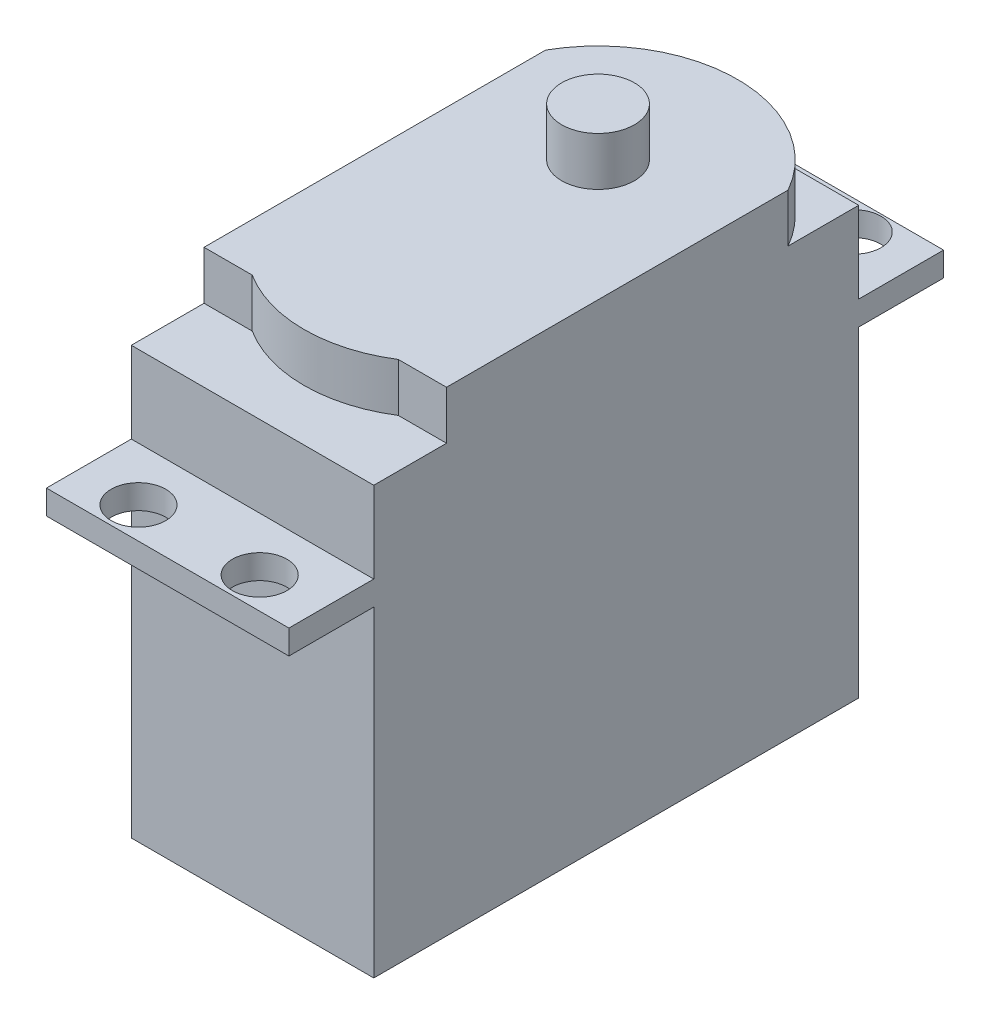
ISO-10303-21;
HEADER;
FILE_DESCRIPTION(('STEP AP214'),'2;1');
FILE_NAME('part.step','',(''),(''),'','','');
FILE_SCHEMA(('AUTOMOTIVE_DESIGN { 1 0 10303 214 1 1 1 1 }'));
ENDSEC;
DATA;
#1=APPLICATION_CONTEXT('core data for automotive mechanical design processes');
#2=APPLICATION_PROTOCOL_DEFINITION('international standard','automotive_design',2000,#1);
#3=PRODUCT_CONTEXT('',#1,'mechanical');
#4=PRODUCT('Part','Part','',(#3));
#5=PRODUCT_RELATED_PRODUCT_CATEGORY('part','',(#4));
#6=PRODUCT_DEFINITION_FORMATION('','',#4);
#7=PRODUCT_DEFINITION_CONTEXT('part definition',#1,'design');
#8=PRODUCT_DEFINITION('design','',#6,#7);
#9=PRODUCT_DEFINITION_SHAPE('','',#8);
#10=(LENGTH_UNIT() NAMED_UNIT(*) SI_UNIT(.MILLI.,.METRE.));
#11=(NAMED_UNIT(*) PLANE_ANGLE_UNIT() SI_UNIT($,.RADIAN.));
#12=(NAMED_UNIT(*) SI_UNIT($,.STERADIAN.) SOLID_ANGLE_UNIT());
#13=UNCERTAINTY_MEASURE_WITH_UNIT(LENGTH_MEASURE(1.E-05),#10,'distance_accuracy_value','');
#14=(GEOMETRIC_REPRESENTATION_CONTEXT(3) GLOBAL_UNCERTAINTY_ASSIGNED_CONTEXT((#13)) GLOBAL_UNIT_ASSIGNED_CONTEXT((#10,
#11,#12)) REPRESENTATION_CONTEXT('',''));
#15=CARTESIAN_POINT('',(0.,0.,0.));
#16=DIRECTION('',(0.,0.,1.));
#17=DIRECTION('',(1.,0.,0.));
#18=AXIS2_PLACEMENT_3D('',#15,#16,#17);
#19=CARTESIAN_POINT('',(0.,17.1,0.));
#20=DIRECTION('',(0.,1.,0.));
#21=DIRECTION('',(0.,0.,1.));
#22=AXIS2_PLACEMENT_3D('',#19,#20,#21);
#23=PLANE('',#22);
#24=CARTESIAN_POINT('',(10.,17.1,-8.49999999999999));
#25=DIRECTION('',(0.,1.,0.));
#26=DIRECTION('',(0.,0.,1.));
#27=AXIS2_PLACEMENT_3D('',#24,#25,#26);
#28=CIRCLE('',#27,3.);
#29=CARTESIAN_POINT('',(10.,17.1,-5.49999999999999));
#30=VERTEX_POINT('',#29);
#31=EDGE_CURVE('E265',#30,#30,#28,.T.);
#32=ORIENTED_EDGE('',*,*,#31,.F.);
#33=EDGE_LOOP('',(#32));
#34=FACE_BOUND('',#33,.T.);
#35=CARTESIAN_POINT('',(10.,17.1,4.5));
#36=DIRECTION('',(0.,1.,0.));
#37=DIRECTION('',(0.,0.,1.));
#38=AXIS2_PLACEMENT_3D('',#35,#36,#37);
#39=CIRCLE('',#38,11.25);
#40=CARTESIAN_POINT('',(3.97401460340303,17.1,14.));
#41=VERTEX_POINT('',#40);
#42=CARTESIAN_POINT('',(16.025985396597,17.1,14.));
#43=VERTEX_POINT('',#42);
#44=EDGE_CURVE('E204',#41,#43,#39,.T.);
#45=ORIENTED_EDGE('',*,*,#44,.T.);
#46=DIRECTION('',(1.,0.,0.));
#47=VECTOR('',#46,1.);
#48=CARTESIAN_POINT('',(0.,17.1,14.));
#49=LINE('',#48,#47);
#50=CARTESIAN_POINT('',(20.,17.1,14.));
#51=VERTEX_POINT('',#50);
#52=EDGE_CURVE('E217',#43,#51,#49,.T.);
#53=ORIENTED_EDGE('',*,*,#52,.T.);
#54=DIRECTION('',(0.,0.,-1.));
#55=VECTOR('',#54,1.);
#56=CARTESIAN_POINT('',(20.,17.1,-20.));
#57=LINE('',#56,#55);
#58=CARTESIAN_POINT('',(20.,17.1,-14.1789083458003));
#59=VERTEX_POINT('',#58);
#60=EDGE_CURVE('E273',#51,#59,#57,.T.);
#61=ORIENTED_EDGE('',*,*,#60,.T.);
#62=CARTESIAN_POINT('',(10.,17.1,-8.49999999999999));
#63=DIRECTION('',(0.,1.,0.));
#64=DIRECTION('',(0.,0.,1.));
#65=AXIS2_PLACEMENT_3D('',#62,#63,#64);
#66=CIRCLE('',#65,11.5);
#67=CARTESIAN_POINT('',(0.,17.1,-14.1789083458003));
#68=VERTEX_POINT('',#67);
#69=EDGE_CURVE('E252',#59,#68,#66,.T.);
#70=ORIENTED_EDGE('',*,*,#69,.T.);
#71=DIRECTION('',(0.,0.,1.));
#72=VECTOR('',#71,1.);
#73=CARTESIAN_POINT('',(0.,17.1,-20.));
#74=LINE('',#73,#72);
#75=CARTESIAN_POINT('',(0.,17.1,14.));
#76=VERTEX_POINT('',#75);
#77=EDGE_CURVE('E268',#68,#76,#74,.T.);
#78=ORIENTED_EDGE('',*,*,#77,.T.);
#79=DIRECTION('',(-1.,0.,0.));
#80=VECTOR('',#79,1.);
#81=CARTESIAN_POINT('',(0.,17.1,14.));
#82=LINE('',#81,#80);
#83=EDGE_CURVE('E232',#41,#76,#82,.T.);
#84=ORIENTED_EDGE('',*,*,#83,.F.);
#85=EDGE_LOOP('',(#45,#53,#61,#70,#78,#84));
#86=FACE_BOUND('',#85,.T.);
#87=ADVANCED_FACE('F54',(#34,#86),#23,.T.);
#88=CARTESIAN_POINT('',(20.,0.,0.));
#89=DIRECTION('',(-1.,0.,0.));
#90=DIRECTION('',(0.,0.,1.));
#91=AXIS2_PLACEMENT_3D('',#88,#89,#90);
#92=PLANE('',#91);
#93=DIRECTION('',(0.,-1.,0.));
#94=VECTOR('',#93,1.);
#95=CARTESIAN_POINT('',(20.,-23.6,20.));
#96=LINE('',#95,#94);
#97=CARTESIAN_POINT('',(20.,4.39999999999999,20.));
#98=VERTEX_POINT('',#97);
#99=CARTESIAN_POINT('',(20.,-22.1,20.));
#100=VERTEX_POINT('',#99);
#101=EDGE_CURVE('E296',#98,#100,#96,.T.);
#102=ORIENTED_EDGE('',*,*,#101,.T.);
#103=DIRECTION('',(0.,0.,-1.));
#104=VECTOR('',#103,1.);
#105=CARTESIAN_POINT('',(20.,-22.1,0.));
#106=LINE('',#105,#104);
#107=CARTESIAN_POINT('',(20.,-22.1,-20.));
#108=VERTEX_POINT('',#107);
#109=EDGE_CURVE('E63',#100,#108,#106,.T.);
#110=ORIENTED_EDGE('',*,*,#109,.T.);
#111=DIRECTION('',(0.,1.,0.));
#112=VECTOR('',#111,1.);
#113=CARTESIAN_POINT('',(20.,-23.6,-20.));
#114=LINE('',#113,#112);
#115=CARTESIAN_POINT('',(20.,4.39999999999999,-20.));
#116=VERTEX_POINT('',#115);
#117=EDGE_CURVE('E276',#108,#116,#114,.T.);
#118=ORIENTED_EDGE('',*,*,#117,.T.);
#119=DIRECTION('',(0.,0.,-1.));
#120=VECTOR('',#119,1.);
#121=CARTESIAN_POINT('',(20.,4.39999999999999,-20.));
#122=LINE('',#121,#120);
#123=CARTESIAN_POINT('',(20.,4.39999999999999,-27.));
#124=VERTEX_POINT('',#123);
#125=EDGE_CURVE('E278',#116,#124,#122,.T.);
#126=ORIENTED_EDGE('',*,*,#125,.T.);
#127=DIRECTION('',(0.,1.,0.));
#128=VECTOR('',#127,1.);
#129=CARTESIAN_POINT('',(20.,4.39999999999999,-27.));
#130=LINE('',#129,#128);
#131=CARTESIAN_POINT('',(20.,6.39999999999999,-27.));
#132=VERTEX_POINT('',#131);
#133=EDGE_CURVE('E281',#124,#132,#130,.T.);
#134=ORIENTED_EDGE('',*,*,#133,.T.);
#135=DIRECTION('',(0.,0.,1.));
#136=VECTOR('',#135,1.);
#137=CARTESIAN_POINT('',(20.,6.39999999999999,-27.));
#138=LINE('',#137,#136);
#139=CARTESIAN_POINT('',(20.,6.39999999999999,-20.));
#140=VERTEX_POINT('',#139);
#141=EDGE_CURVE('E283',#132,#140,#138,.T.);
#142=ORIENTED_EDGE('',*,*,#141,.T.);
#143=DIRECTION('',(0.,1.,0.));
#144=VECTOR('',#143,1.);
#145=CARTESIAN_POINT('',(20.,6.39999999999999,-20.));
#146=LINE('',#145,#144);
#147=CARTESIAN_POINT('',(20.,13.1,-20.));
#148=VERTEX_POINT('',#147);
#149=EDGE_CURVE('E285',#140,#148,#146,.T.);
#150=ORIENTED_EDGE('',*,*,#149,.T.);
#151=DIRECTION('',(0.,0.,-1.));
#152=VECTOR('',#151,1.);
#153=CARTESIAN_POINT('',(20.,13.1,0.));
#154=LINE('',#153,#152);
#155=CARTESIAN_POINT('',(20.,13.1,-14.1789083458003));
#156=VERTEX_POINT('',#155);
#157=EDGE_CURVE('E247',#156,#148,#154,.T.);
#158=ORIENTED_EDGE('',*,*,#157,.F.);
#159=DIRECTION('',(0.,1.,0.));
#160=VECTOR('',#159,1.);
#161=CARTESIAN_POINT('',(20.,13.1,-14.1789083458003));
#162=LINE('',#161,#160);
#163=EDGE_CURVE('E239',#156,#59,#162,.T.);
#164=ORIENTED_EDGE('',*,*,#163,.T.);
#165=ORIENTED_EDGE('',*,*,#60,.F.);
#166=DIRECTION('',(0.,1.,0.));
#167=VECTOR('',#166,1.);
#168=CARTESIAN_POINT('',(20.,13.1,14.));
#169=LINE('',#168,#167);
#170=CARTESIAN_POINT('',(20.,13.1,14.));
#171=VERTEX_POINT('',#170);
#172=EDGE_CURVE('E240',#171,#51,#169,.T.);
#173=ORIENTED_EDGE('',*,*,#172,.F.);
#174=DIRECTION('',(0.,0.,-1.));
#175=VECTOR('',#174,1.);
#176=CARTESIAN_POINT('',(20.,13.1,0.));
#177=LINE('',#176,#175);
#178=CARTESIAN_POINT('',(20.,13.1,20.));
#179=VERTEX_POINT('',#178);
#180=EDGE_CURVE('E228',#179,#171,#177,.T.);
#181=ORIENTED_EDGE('',*,*,#180,.F.);
#182=DIRECTION('',(0.,-1.,0.));
#183=VECTOR('',#182,1.);
#184=CARTESIAN_POINT('',(20.,12.4,20.));
#185=LINE('',#184,#183);
#186=CARTESIAN_POINT('',(20.,6.39999999999999,20.));
#187=VERTEX_POINT('',#186);
#188=EDGE_CURVE('E288',#179,#187,#185,.T.);
#189=ORIENTED_EDGE('',*,*,#188,.T.);
#190=DIRECTION('',(0.,0.,1.));
#191=VECTOR('',#190,1.);
#192=CARTESIAN_POINT('',(20.,6.39999999999999,27.));
#193=LINE('',#192,#191);
#194=CARTESIAN_POINT('',(20.,6.39999999999999,27.));
#195=VERTEX_POINT('',#194);
#196=EDGE_CURVE('E290',#187,#195,#193,.T.);
#197=ORIENTED_EDGE('',*,*,#196,.T.);
#198=DIRECTION('',(0.,-1.,0.));
#199=VECTOR('',#198,1.);
#200=CARTESIAN_POINT('',(20.,4.39999999999999,27.));
#201=LINE('',#200,#199);
#202=CARTESIAN_POINT('',(20.,4.39999999999999,27.));
#203=VERTEX_POINT('',#202);
#204=EDGE_CURVE('E292',#195,#203,#201,.T.);
#205=ORIENTED_EDGE('',*,*,#204,.T.);
#206=DIRECTION('',(0.,0.,-1.));
#207=VECTOR('',#206,1.);
#208=CARTESIAN_POINT('',(20.,4.39999999999999,20.));
#209=LINE('',#208,#207);
#210=EDGE_CURVE('E294',#203,#98,#209,.T.);
#211=ORIENTED_EDGE('',*,*,#210,.T.);
#212=EDGE_LOOP('',(#102,#110,#118,#126,#134,#142,#150,#158,#164,#165,#173,#181,#189,#197,#205,#211));
#213=FACE_BOUND('',#212,.T.);
#214=ADVANCED_FACE('F416',(#213),#92,.F.);
#215=CARTESIAN_POINT('',(20.,6.39999999999999,20.));
#216=DIRECTION('',(0.,0.,-1.));
#217=DIRECTION('',(-1.,0.,0.));
#218=AXIS2_PLACEMENT_3D('',#215,#216,#217);
#219=PLANE('',#218);
#220=DIRECTION('',(1.,0.,0.));
#221=VECTOR('',#220,1.);
#222=CARTESIAN_POINT('',(0.,13.1,20.));
#223=LINE('',#222,#221);
#224=CARTESIAN_POINT('',(0.,13.1,20.));
#225=VERTEX_POINT('',#224);
#226=EDGE_CURVE('E223',#225,#179,#223,.T.);
#227=ORIENTED_EDGE('',*,*,#226,.F.);
#228=DIRECTION('',(0.,-1.,0.));
#229=VECTOR('',#228,1.);
#230=CARTESIAN_POINT('',(0.,6.39999999999999,20.));
#231=LINE('',#230,#229);
#232=CARTESIAN_POINT('',(0.,6.39999999999999,20.));
#233=VERTEX_POINT('',#232);
#234=EDGE_CURVE('E310',#225,#233,#231,.T.);
#235=ORIENTED_EDGE('',*,*,#234,.T.);
#236=DIRECTION('',(-1.,0.,0.));
#237=VECTOR('',#236,1.);
#238=CARTESIAN_POINT('',(20.,6.39999999999999,20.));
#239=LINE('',#238,#237);
#240=EDGE_CURVE('E327',#187,#233,#239,.T.);
#241=ORIENTED_EDGE('',*,*,#240,.F.);
#242=ORIENTED_EDGE('',*,*,#188,.F.);
#243=EDGE_LOOP('',(#227,#235,#241,#242));
#244=FACE_BOUND('',#243,.T.);
#245=ADVANCED_FACE('F450',(#244),#219,.F.);
#246=CARTESIAN_POINT('',(20.,23.6,-20.));
#247=DIRECTION('',(0.,0.,1.));
#248=DIRECTION('',(0.,-1.,0.));
#249=AXIS2_PLACEMENT_3D('',#246,#247,#248);
#250=PLANE('',#249);
#251=DIRECTION('',(-1.,0.,0.));
#252=VECTOR('',#251,1.);
#253=CARTESIAN_POINT('',(0.,13.1,-20.));
#254=LINE('',#253,#252);
#255=CARTESIAN_POINT('',(10.,13.1,-20.));
#256=VERTEX_POINT('',#255);
#257=EDGE_CURVE('E245',#148,#256,#254,.T.);
#258=ORIENTED_EDGE('',*,*,#257,.F.);
#259=ORIENTED_EDGE('',*,*,#149,.F.);
#260=DIRECTION('',(-1.,0.,0.));
#261=VECTOR('',#260,1.);
#262=CARTESIAN_POINT('',(20.,6.39999999999999,-20.));
#263=LINE('',#262,#261);
#264=CARTESIAN_POINT('',(0.,6.39999999999999,-20.));
#265=VERTEX_POINT('',#264);
#266=EDGE_CURVE('E330',#140,#265,#263,.T.);
#267=ORIENTED_EDGE('',*,*,#266,.T.);
#268=DIRECTION('',(0.,1.,0.));
#269=VECTOR('',#268,1.);
#270=CARTESIAN_POINT('',(0.,23.6,-20.));
#271=LINE('',#270,#269);
#272=CARTESIAN_POINT('',(0.,13.1,-20.));
#273=VERTEX_POINT('',#272);
#274=EDGE_CURVE('E307',#265,#273,#271,.T.);
#275=ORIENTED_EDGE('',*,*,#274,.T.);
#276=DIRECTION('',(-1.,0.,0.));
#277=VECTOR('',#276,1.);
#278=CARTESIAN_POINT('',(0.,13.1,-20.));
#279=LINE('',#278,#277);
#280=EDGE_CURVE('E255',#256,#273,#279,.T.);
#281=ORIENTED_EDGE('',*,*,#280,.F.);
#282=EDGE_LOOP('',(#258,#259,#267,#275,#281));
#283=FACE_BOUND('',#282,.T.);
#284=ADVANCED_FACE('F412',(#283),#250,.F.);
#285=CARTESIAN_POINT('',(0.,0.,0.));
#286=DIRECTION('',(-1.,0.,0.));
#287=DIRECTION('',(0.,0.,1.));
#288=AXIS2_PLACEMENT_3D('',#285,#286,#287);
#289=PLANE('',#288);
#290=DIRECTION('',(0.,1.,0.));
#291=VECTOR('',#290,1.);
#292=CARTESIAN_POINT('',(0.,-23.6,-20.));
#293=LINE('',#292,#291);
#294=CARTESIAN_POINT('',(0.,-22.1,-20.));
#295=VERTEX_POINT('',#294);
#296=CARTESIAN_POINT('',(0.,4.39999999999999,-20.));
#297=VERTEX_POINT('',#296);
#298=EDGE_CURVE('E275',#295,#297,#293,.T.);
#299=ORIENTED_EDGE('',*,*,#298,.F.);
#300=DIRECTION('',(0.,0.,1.));
#301=VECTOR('',#300,1.);
#302=CARTESIAN_POINT('',(0.,-22.1,20.));
#303=LINE('',#302,#301);
#304=CARTESIAN_POINT('',(0.,-22.1,20.));
#305=VERTEX_POINT('',#304);
#306=EDGE_CURVE('E77',#295,#305,#303,.T.);
#307=ORIENTED_EDGE('',*,*,#306,.T.);
#308=DIRECTION('',(0.,-1.,0.));
#309=VECTOR('',#308,1.);
#310=CARTESIAN_POINT('',(0.,-23.6,20.));
#311=LINE('',#310,#309);
#312=CARTESIAN_POINT('',(0.,4.39999999999999,20.));
#313=VERTEX_POINT('',#312);
#314=EDGE_CURVE('E279',#313,#305,#311,.T.);
#315=ORIENTED_EDGE('',*,*,#314,.F.);
#316=DIRECTION('',(0.,0.,-1.));
#317=VECTOR('',#316,1.);
#318=CARTESIAN_POINT('',(0.,4.39999999999999,20.));
#319=LINE('',#318,#317);
#320=CARTESIAN_POINT('',(0.,4.39999999999999,27.));
#321=VERTEX_POINT('',#320);
#322=EDGE_CURVE('E316',#321,#313,#319,.T.);
#323=ORIENTED_EDGE('',*,*,#322,.F.);
#324=DIRECTION('',(0.,-1.,0.));
#325=VECTOR('',#324,1.);
#326=CARTESIAN_POINT('',(0.,4.39999999999999,27.));
#327=LINE('',#326,#325);
#328=CARTESIAN_POINT('',(0.,6.39999999999999,27.));
#329=VERTEX_POINT('',#328);
#330=EDGE_CURVE('E314',#329,#321,#327,.T.);
#331=ORIENTED_EDGE('',*,*,#330,.F.);
#332=DIRECTION('',(0.,0.,1.));
#333=VECTOR('',#332,1.);
#334=CARTESIAN_POINT('',(0.,6.39999999999999,27.));
#335=LINE('',#334,#333);
#336=EDGE_CURVE('E312',#233,#329,#335,.T.);
#337=ORIENTED_EDGE('',*,*,#336,.F.);
#338=ORIENTED_EDGE('',*,*,#234,.F.);
#339=DIRECTION('',(0.,0.,1.));
#340=VECTOR('',#339,1.);
#341=CARTESIAN_POINT('',(0.,13.1,0.));
#342=LINE('',#341,#340);
#343=CARTESIAN_POINT('',(0.,13.1,14.));
#344=VERTEX_POINT('',#343);
#345=EDGE_CURVE('E221',#344,#225,#342,.T.);
#346=ORIENTED_EDGE('',*,*,#345,.F.);
#347=DIRECTION('',(0.,1.,0.));
#348=VECTOR('',#347,1.);
#349=CARTESIAN_POINT('',(0.,13.1,14.));
#350=LINE('',#349,#348);
#351=EDGE_CURVE('E208',#344,#76,#350,.T.);
#352=ORIENTED_EDGE('',*,*,#351,.T.);
#353=ORIENTED_EDGE('',*,*,#77,.F.);
#354=DIRECTION('',(0.,1.,0.));
#355=VECTOR('',#354,1.);
#356=CARTESIAN_POINT('',(0.,13.1,-14.1789083458003));
#357=LINE('',#356,#355);
#358=CARTESIAN_POINT('',(0.,13.1,-14.1789083458003));
#359=VERTEX_POINT('',#358);
#360=EDGE_CURVE('E260',#359,#68,#357,.T.);
#361=ORIENTED_EDGE('',*,*,#360,.F.);
#362=DIRECTION('',(0.,0.,1.));
#363=VECTOR('',#362,1.);
#364=CARTESIAN_POINT('',(0.,13.1,0.));
#365=LINE('',#364,#363);
#366=EDGE_CURVE('E257',#273,#359,#365,.T.);
#367=ORIENTED_EDGE('',*,*,#366,.F.);
#368=ORIENTED_EDGE('',*,*,#274,.F.);
#369=DIRECTION('',(0.,0.,1.));
#370=VECTOR('',#369,1.);
#371=CARTESIAN_POINT('',(0.,6.39999999999999,-27.));
#372=LINE('',#371,#370);
#373=CARTESIAN_POINT('',(0.,6.39999999999999,-27.));
#374=VERTEX_POINT('',#373);
#375=EDGE_CURVE('E304',#374,#265,#372,.T.);
#376=ORIENTED_EDGE('',*,*,#375,.F.);
#377=DIRECTION('',(0.,1.,0.));
#378=VECTOR('',#377,1.);
#379=CARTESIAN_POINT('',(0.,4.39999999999999,-27.));
#380=LINE('',#379,#378);
#381=CARTESIAN_POINT('',(0.,4.39999999999999,-27.));
#382=VERTEX_POINT('',#381);
#383=EDGE_CURVE('E302',#382,#374,#380,.T.);
#384=ORIENTED_EDGE('',*,*,#383,.F.);
#385=DIRECTION('',(0.,0.,-1.));
#386=VECTOR('',#385,1.);
#387=CARTESIAN_POINT('',(0.,4.39999999999999,-20.));
#388=LINE('',#387,#386);
#389=EDGE_CURVE('E300',#297,#382,#388,.T.);
#390=ORIENTED_EDGE('',*,*,#389,.F.);
#391=EDGE_LOOP('',(#299,#307,#315,#323,#331,#337,#338,#346,#352,#353,#361,#367,#368,#376,#384,#390));
#392=FACE_BOUND('',#391,.T.);
#393=ADVANCED_FACE('F422',(#392),#289,.T.);
#394=CARTESIAN_POINT('',(20.,-23.6,0.));
#395=DIRECTION('',(0.,1.,0.));
#396=DIRECTION('',(0.,0.,1.));
#397=AXIS2_PLACEMENT_3D('',#394,#395,#396);
#398=PLANE('',#397);
#399=DIRECTION('',(0.,0.,-1.));
#400=VECTOR('',#399,1.);
#401=CARTESIAN_POINT('',(1.50000000000002,-23.6,-20.));
#402=LINE('',#401,#400);
#403=CARTESIAN_POINT('',(1.50000000000002,-23.6,18.5));
#404=VERTEX_POINT('',#403);
#405=CARTESIAN_POINT('',(1.50000000000002,-23.6,-18.5));
#406=VERTEX_POINT('',#405);
#407=EDGE_CURVE('E349',#404,#406,#402,.T.);
#408=ORIENTED_EDGE('',*,*,#407,.T.);
#409=DIRECTION('',(1.,0.,0.));
#410=VECTOR('',#409,1.);
#411=CARTESIAN_POINT('',(20.,-23.6,-18.5));
#412=LINE('',#411,#410);
#413=CARTESIAN_POINT('',(18.5,-23.6,-18.5));
#414=VERTEX_POINT('',#413);
#415=EDGE_CURVE('E351',#406,#414,#412,.T.);
#416=ORIENTED_EDGE('',*,*,#415,.T.);
#417=DIRECTION('',(0.,0.,1.));
#418=VECTOR('',#417,1.);
#419=CARTESIAN_POINT('',(18.5,-23.6,0.));
#420=LINE('',#419,#418);
#421=CARTESIAN_POINT('',(18.5,-23.6,18.5));
#422=VERTEX_POINT('',#421);
#423=EDGE_CURVE('E347',#414,#422,#420,.T.);
#424=ORIENTED_EDGE('',*,*,#423,.T.);
#425=DIRECTION('',(-1.,0.,0.));
#426=VECTOR('',#425,1.);
#427=CARTESIAN_POINT('',(20.,-23.6,18.5));
#428=LINE('',#427,#426);
#429=EDGE_CURVE('E345',#422,#404,#428,.T.);
#430=ORIENTED_EDGE('',*,*,#429,.T.);
#431=EDGE_LOOP('',(#408,#416,#424,#430));
#432=FACE_BOUND('',#431,.T.);
#433=ADVANCED_FACE('F465',(#432),#398,.F.);
#434=CARTESIAN_POINT('',(20.,-23.6,-20.));
#435=DIRECTION('',(0.,0.,1.));
#436=DIRECTION('',(1.,0.,0.));
#437=AXIS2_PLACEMENT_3D('',#434,#435,#436);
#438=PLANE('',#437);
#439=ORIENTED_EDGE('',*,*,#117,.F.);
#440=DIRECTION('',(-1.,0.,0.));
#441=VECTOR('',#440,1.);
#442=CARTESIAN_POINT('',(20.,-22.1,-20.));
#443=LINE('',#442,#441);
#444=EDGE_CURVE('E342',#108,#295,#443,.T.);
#445=ORIENTED_EDGE('',*,*,#444,.T.);
#446=ORIENTED_EDGE('',*,*,#298,.T.);
#447=DIRECTION('',(-1.,0.,0.));
#448=VECTOR('',#447,1.);
#449=CARTESIAN_POINT('',(20.,4.39999999999999,-20.));
#450=LINE('',#449,#448);
#451=EDGE_CURVE('E339',#116,#297,#450,.T.);
#452=ORIENTED_EDGE('',*,*,#451,.F.);
#453=EDGE_LOOP('',(#439,#445,#446,#452));
#454=FACE_BOUND('',#453,.T.);
#455=ADVANCED_FACE('F428',(#454),#438,.F.);
#456=CARTESIAN_POINT('',(20.,4.39999999999999,-20.));
#457=DIRECTION('',(0.,1.,0.));
#458=DIRECTION('',(0.,0.,1.));
#459=AXIS2_PLACEMENT_3D('',#456,#457,#458);
#460=PLANE('',#459);
#461=CARTESIAN_POINT('',(5.,4.39999999999999,-24.5894541729001));
#462=DIRECTION('',(0.,1.,0.));
#463=DIRECTION('',(0.,0.,-1.));
#464=AXIS2_PLACEMENT_3D('',#461,#462,#463);
#465=CIRCLE('',#464,2.25);
#466=CARTESIAN_POINT('',(5.,4.39999999999999,-26.8394541729001));
#467=VERTEX_POINT('',#466);
#468=EDGE_CURVE('E385',#467,#467,#465,.T.);
#469=ORIENTED_EDGE('',*,*,#468,.T.);
#470=EDGE_LOOP('',(#469));
#471=FACE_BOUND('',#470,.T.);
#472=CARTESIAN_POINT('',(15.,4.39999999999999,-24.5894541729001));
#473=DIRECTION('',(0.,1.,0.));
#474=DIRECTION('',(0.,0.,-1.));
#475=AXIS2_PLACEMENT_3D('',#472,#473,#474);
#476=CIRCLE('',#475,2.25);
#477=CARTESIAN_POINT('',(15.,4.39999999999999,-26.8394541729001));
#478=VERTEX_POINT('',#477);
#479=EDGE_CURVE('E233',#478,#478,#476,.T.);
#480=ORIENTED_EDGE('',*,*,#479,.T.);
#481=EDGE_LOOP('',(#480));
#482=FACE_BOUND('',#481,.T.);
#483=ORIENTED_EDGE('',*,*,#389,.T.);
#484=DIRECTION('',(-1.,0.,0.));
#485=VECTOR('',#484,1.);
#486=CARTESIAN_POINT('',(20.,4.39999999999999,-27.));
#487=LINE('',#486,#485);
#488=EDGE_CURVE('E336',#124,#382,#487,.T.);
#489=ORIENTED_EDGE('',*,*,#488,.F.);
#490=ORIENTED_EDGE('',*,*,#125,.F.);
#491=ORIENTED_EDGE('',*,*,#451,.T.);
#492=EDGE_LOOP('',(#483,#489,#490,#491));
#493=FACE_BOUND('',#492,.T.);
#494=ADVANCED_FACE('F424',(#471,#482,#493),#460,.F.);
#495=CARTESIAN_POINT('',(20.,4.39999999999999,-27.));
#496=DIRECTION('',(0.,0.,1.));
#497=DIRECTION('',(1.,0.,0.));
#498=AXIS2_PLACEMENT_3D('',#495,#496,#497);
#499=PLANE('',#498);
#500=ORIENTED_EDGE('',*,*,#383,.T.);
#501=DIRECTION('',(-1.,0.,0.));
#502=VECTOR('',#501,1.);
#503=CARTESIAN_POINT('',(20.,6.39999999999999,-27.));
#504=LINE('',#503,#502);
#505=EDGE_CURVE('E333',#132,#374,#504,.T.);
#506=ORIENTED_EDGE('',*,*,#505,.F.);
#507=ORIENTED_EDGE('',*,*,#133,.F.);
#508=ORIENTED_EDGE('',*,*,#488,.T.);
#509=EDGE_LOOP('',(#500,#506,#507,#508));
#510=FACE_BOUND('',#509,.T.);
#511=ADVANCED_FACE('F401',(#510),#499,.F.);
#512=CARTESIAN_POINT('',(20.,6.39999999999999,-27.));
#513=DIRECTION('',(0.,-1.,0.));
#514=DIRECTION('',(0.,0.,-1.));
#515=AXIS2_PLACEMENT_3D('',#512,#513,#514);
#516=PLANE('',#515);
#517=CARTESIAN_POINT('',(5.,6.39999999999999,-24.5894541729001));
#518=DIRECTION('',(0.,1.,0.));
#519=DIRECTION('',(0.,0.,-1.));
#520=AXIS2_PLACEMENT_3D('',#517,#518,#519);
#521=CIRCLE('',#520,2.25);
#522=CARTESIAN_POINT('',(5.,6.39999999999999,-26.8394541729001));
#523=VERTEX_POINT('',#522);
#524=EDGE_CURVE('E382',#523,#523,#521,.T.);
#525=ORIENTED_EDGE('',*,*,#524,.F.);
#526=EDGE_LOOP('',(#525));
#527=FACE_BOUND('',#526,.T.);
#528=CARTESIAN_POINT('',(15.,6.39999999999999,-24.5894541729001));
#529=DIRECTION('',(0.,1.,0.));
#530=DIRECTION('',(0.,0.,-1.));
#531=AXIS2_PLACEMENT_3D('',#528,#529,#530);
#532=CIRCLE('',#531,2.25);
#533=CARTESIAN_POINT('',(15.,6.39999999999999,-26.8394541729001));
#534=VERTEX_POINT('',#533);
#535=EDGE_CURVE('E388',#534,#534,#532,.T.);
#536=ORIENTED_EDGE('',*,*,#535,.F.);
#537=EDGE_LOOP('',(#536));
#538=FACE_BOUND('',#537,.T.);
#539=ORIENTED_EDGE('',*,*,#375,.T.);
#540=ORIENTED_EDGE('',*,*,#266,.F.);
#541=ORIENTED_EDGE('',*,*,#141,.F.);
#542=ORIENTED_EDGE('',*,*,#505,.T.);
#543=EDGE_LOOP('',(#539,#540,#541,#542));
#544=FACE_BOUND('',#543,.T.);
#545=ADVANCED_FACE('F397',(#527,#538,#544),#516,.F.);
#546=CARTESIAN_POINT('',(20.,6.39999999999999,27.));
#547=DIRECTION('',(0.,-1.,0.));
#548=DIRECTION('',(0.,0.,-1.));
#549=AXIS2_PLACEMENT_3D('',#546,#547,#548);
#550=PLANE('',#549);
#551=CARTESIAN_POINT('',(15.,6.39999999999999,24.4105458270999));
#552=DIRECTION('',(0.,1.,0.));
#553=DIRECTION('',(0.,0.,1.));
#554=AXIS2_PLACEMENT_3D('',#551,#552,#553);
#555=CIRCLE('',#554,2.25);
#556=CARTESIAN_POINT('',(15.,6.39999999999999,26.6605458270999));
#557=VERTEX_POINT('',#556);
#558=EDGE_CURVE('E365',#557,#557,#555,.T.);
#559=ORIENTED_EDGE('',*,*,#558,.F.);
#560=EDGE_LOOP('',(#559));
#561=FACE_BOUND('',#560,.T.);
#562=CARTESIAN_POINT('',(5.,6.39999999999999,24.4105458270999));
#563=DIRECTION('',(0.,1.,0.));
#564=DIRECTION('',(0.,0.,1.));
#565=AXIS2_PLACEMENT_3D('',#562,#563,#564);
#566=CIRCLE('',#565,2.25);
#567=CARTESIAN_POINT('',(5.,6.39999999999999,26.6605458270999));
#568=VERTEX_POINT('',#567);
#569=EDGE_CURVE('E376',#568,#568,#566,.T.);
#570=ORIENTED_EDGE('',*,*,#569,.F.);
#571=EDGE_LOOP('',(#570));
#572=FACE_BOUND('',#571,.T.);
#573=ORIENTED_EDGE('',*,*,#336,.T.);
#574=DIRECTION('',(-1.,0.,0.));
#575=VECTOR('',#574,1.);
#576=CARTESIAN_POINT('',(20.,6.39999999999999,27.));
#577=LINE('',#576,#575);
#578=EDGE_CURVE('E324',#195,#329,#577,.T.);
#579=ORIENTED_EDGE('',*,*,#578,.F.);
#580=ORIENTED_EDGE('',*,*,#196,.F.);
#581=ORIENTED_EDGE('',*,*,#240,.T.);
#582=EDGE_LOOP('',(#573,#579,#580,#581));
#583=FACE_BOUND('',#582,.T.);
#584=ADVANCED_FACE('F400',(#561,#572,#583),#550,.F.);
#585=CARTESIAN_POINT('',(20.,4.39999999999999,27.));
#586=DIRECTION('',(0.,0.,-1.));
#587=DIRECTION('',(-1.,0.,0.));
#588=AXIS2_PLACEMENT_3D('',#585,#586,#587);
#589=PLANE('',#588);
#590=ORIENTED_EDGE('',*,*,#330,.T.);
#591=DIRECTION('',(-1.,0.,0.));
#592=VECTOR('',#591,1.);
#593=CARTESIAN_POINT('',(20.,4.39999999999999,27.));
#594=LINE('',#593,#592);
#595=EDGE_CURVE('E321',#203,#321,#594,.T.);
#596=ORIENTED_EDGE('',*,*,#595,.F.);
#597=ORIENTED_EDGE('',*,*,#204,.F.);
#598=ORIENTED_EDGE('',*,*,#578,.T.);
#599=EDGE_LOOP('',(#590,#596,#597,#598));
#600=FACE_BOUND('',#599,.T.);
#601=ADVANCED_FACE('F472',(#600),#589,.F.);
#602=CARTESIAN_POINT('',(20.,4.39999999999999,20.));
#603=DIRECTION('',(0.,1.,0.));
#604=DIRECTION('',(0.,0.,1.));
#605=AXIS2_PLACEMENT_3D('',#602,#603,#604);
#606=PLANE('',#605);
#607=CARTESIAN_POINT('',(15.,4.39999999999999,24.4105458270999));
#608=DIRECTION('',(0.,1.,0.));
#609=DIRECTION('',(0.,0.,1.));
#610=AXIS2_PLACEMENT_3D('',#607,#608,#609);
#611=CIRCLE('',#610,2.25);
#612=CARTESIAN_POINT('',(15.,4.39999999999999,26.6605458270999));
#613=VERTEX_POINT('',#612);
#614=EDGE_CURVE('E371',#613,#613,#611,.T.);
#615=ORIENTED_EDGE('',*,*,#614,.T.);
#616=EDGE_LOOP('',(#615));
#617=FACE_BOUND('',#616,.T.);
#618=CARTESIAN_POINT('',(5.,4.39999999999999,24.4105458270999));
#619=DIRECTION('',(0.,1.,0.));
#620=DIRECTION('',(0.,0.,1.));
#621=AXIS2_PLACEMENT_3D('',#618,#619,#620);
#622=CIRCLE('',#621,2.25);
#623=CARTESIAN_POINT('',(5.,4.39999999999999,26.6605458270999));
#624=VERTEX_POINT('',#623);
#625=EDGE_CURVE('E379',#624,#624,#622,.T.);
#626=ORIENTED_EDGE('',*,*,#625,.T.);
#627=EDGE_LOOP('',(#626));
#628=FACE_BOUND('',#627,.T.);
#629=ORIENTED_EDGE('',*,*,#322,.T.);
#630=DIRECTION('',(-1.,0.,0.));
#631=VECTOR('',#630,1.);
#632=CARTESIAN_POINT('',(20.,4.39999999999999,20.));
#633=LINE('',#632,#631);
#634=EDGE_CURVE('E298',#98,#313,#633,.T.);
#635=ORIENTED_EDGE('',*,*,#634,.F.);
#636=ORIENTED_EDGE('',*,*,#210,.F.);
#637=ORIENTED_EDGE('',*,*,#595,.T.);
#638=EDGE_LOOP('',(#629,#635,#636,#637));
#639=FACE_BOUND('',#638,.T.);
#640=ADVANCED_FACE('F469',(#617,#628,#639),#606,.F.);
#641=CARTESIAN_POINT('',(20.,-23.6,20.));
#642=DIRECTION('',(0.,0.,-1.));
#643=DIRECTION('',(-1.,0.,0.));
#644=AXIS2_PLACEMENT_3D('',#641,#642,#643);
#645=PLANE('',#644);
#646=ORIENTED_EDGE('',*,*,#314,.T.);
#647=DIRECTION('',(1.,0.,0.));
#648=VECTOR('',#647,1.);
#649=CARTESIAN_POINT('',(20.,-22.1,20.));
#650=LINE('',#649,#648);
#651=EDGE_CURVE('E12',#305,#100,#650,.T.);
#652=ORIENTED_EDGE('',*,*,#651,.T.);
#653=ORIENTED_EDGE('',*,*,#101,.F.);
#654=ORIENTED_EDGE('',*,*,#634,.T.);
#655=EDGE_LOOP('',(#646,#652,#653,#654));
#656=FACE_BOUND('',#655,.T.);
#657=ADVANCED_FACE('F466',(#656),#645,.F.);
#658=CARTESIAN_POINT('',(10.,17.1,-8.49999999999999));
#659=DIRECTION('',(0.,1.,0.));
#660=DIRECTION('',(0.,0.,1.));
#661=AXIS2_PLACEMENT_3D('',#658,#659,#660);
#662=CYLINDRICAL_SURFACE('',#661,3.);
#663=ORIENTED_EDGE('',*,*,#31,.T.);
#664=EDGE_LOOP('',(#663));
#665=FACE_BOUND('',#664,.T.);
#666=CARTESIAN_POINT('',(10.,21.1,-8.49999999999999));
#667=DIRECTION('',(0.,1.,0.));
#668=DIRECTION('',(0.,0.,1.));
#669=AXIS2_PLACEMENT_3D('',#666,#667,#668);
#670=CIRCLE('',#669,3.);
#671=CARTESIAN_POINT('',(10.,21.1,-5.49999999999999));
#672=VERTEX_POINT('',#671);
#673=EDGE_CURVE('E264',#672,#672,#670,.T.);
#674=ORIENTED_EDGE('',*,*,#673,.F.);
#675=EDGE_LOOP('',(#674));
#676=FACE_BOUND('',#675,.T.);
#677=ADVANCED_FACE('F456',(#665,#676),#662,.T.);
#678=CARTESIAN_POINT('',(0.,21.1,0.));
#679=DIRECTION('',(0.,-1.,0.));
#680=DIRECTION('',(0.,0.,-1.));
#681=AXIS2_PLACEMENT_3D('',#678,#679,#680);
#682=PLANE('',#681);
#683=ORIENTED_EDGE('',*,*,#673,.T.);
#684=EDGE_LOOP('',(#683));
#685=FACE_BOUND('',#684,.T.);
#686=ADVANCED_FACE('F458',(#685),#682,.F.);
#687=CARTESIAN_POINT('',(10.,13.1,-8.49999999999999));
#688=DIRECTION('',(0.,1.,0.));
#689=DIRECTION('',(0.,0.,1.));
#690=AXIS2_PLACEMENT_3D('',#687,#688,#689);
#691=CYLINDRICAL_SURFACE('',#690,11.5);
#692=ORIENTED_EDGE('',*,*,#69,.F.);
#693=ORIENTED_EDGE('',*,*,#163,.F.);
#694=CARTESIAN_POINT('',(10.,13.1,-8.49999999999999));
#695=DIRECTION('',(0.,1.,0.));
#696=DIRECTION('',(0.,0.,1.));
#697=AXIS2_PLACEMENT_3D('',#694,#695,#696);
#698=CIRCLE('',#697,11.5);
#699=EDGE_CURVE('E249',#156,#256,#698,.T.);
#700=ORIENTED_EDGE('',*,*,#699,.T.);
#701=CARTESIAN_POINT('',(10.,13.1,-8.49999999999999));
#702=DIRECTION('',(0.,1.,0.));
#703=DIRECTION('',(0.,0.,1.));
#704=AXIS2_PLACEMENT_3D('',#701,#702,#703);
#705=CIRCLE('',#704,11.5);
#706=EDGE_CURVE('E253',#256,#359,#705,.T.);
#707=ORIENTED_EDGE('',*,*,#706,.T.);
#708=ORIENTED_EDGE('',*,*,#360,.T.);
#709=EDGE_LOOP('',(#692,#693,#700,#707,#708));
#710=FACE_BOUND('',#709,.T.);
#711=ADVANCED_FACE('F460',(#710),#691,.T.);
#712=CARTESIAN_POINT('',(0.,13.1,0.));
#713=DIRECTION('',(0.,1.,0.));
#714=DIRECTION('',(0.,0.,1.));
#715=AXIS2_PLACEMENT_3D('',#712,#713,#714);
#716=PLANE('',#715);
#717=ORIENTED_EDGE('',*,*,#706,.F.);
#718=ORIENTED_EDGE('',*,*,#280,.T.);
#719=ORIENTED_EDGE('',*,*,#366,.T.);
#720=EDGE_LOOP('',(#717,#718,#719));
#721=FACE_BOUND('',#720,.T.);
#722=ADVANCED_FACE('F526',(#721),#716,.T.);
#723=CARTESIAN_POINT('',(0.,13.1,0.));
#724=DIRECTION('',(0.,1.,0.));
#725=DIRECTION('',(0.,0.,1.));
#726=AXIS2_PLACEMENT_3D('',#723,#724,#725);
#727=PLANE('',#726);
#728=ORIENTED_EDGE('',*,*,#699,.F.);
#729=ORIENTED_EDGE('',*,*,#157,.T.);
#730=ORIENTED_EDGE('',*,*,#257,.T.);
#731=EDGE_LOOP('',(#728,#729,#730));
#732=FACE_BOUND('',#731,.T.);
#733=ADVANCED_FACE('F528',(#732),#727,.T.);
#734=CARTESIAN_POINT('',(10.,13.1,4.5));
#735=DIRECTION('',(0.,1.,0.));
#736=DIRECTION('',(0.,0.,1.));
#737=AXIS2_PLACEMENT_3D('',#734,#735,#736);
#738=CYLINDRICAL_SURFACE('',#737,11.25);
#739=ORIENTED_EDGE('',*,*,#44,.F.);
#740=DIRECTION('',(0.,1.,0.));
#741=VECTOR('',#740,1.);
#742=CARTESIAN_POINT('',(3.97401460340303,13.1,14.));
#743=LINE('',#742,#741);
#744=CARTESIAN_POINT('',(3.97401460340303,13.1,14.));
#745=VERTEX_POINT('',#744);
#746=EDGE_CURVE('E197',#745,#41,#743,.T.);
#747=ORIENTED_EDGE('',*,*,#746,.F.);
#748=CARTESIAN_POINT('',(10.,13.1,4.5));
#749=DIRECTION('',(0.,1.,0.));
#750=DIRECTION('',(0.,0.,1.));
#751=AXIS2_PLACEMENT_3D('',#748,#749,#750);
#752=CIRCLE('',#751,11.25);
#753=CARTESIAN_POINT('',(16.025985396597,13.1,14.));
#754=VERTEX_POINT('',#753);
#755=EDGE_CURVE('E201',#745,#754,#752,.T.);
#756=ORIENTED_EDGE('',*,*,#755,.T.);
#757=DIRECTION('',(0.,1.,0.));
#758=VECTOR('',#757,1.);
#759=CARTESIAN_POINT('',(16.025985396597,13.1,14.));
#760=LINE('',#759,#758);
#761=EDGE_CURVE('E237',#754,#43,#760,.T.);
#762=ORIENTED_EDGE('',*,*,#761,.T.);
#763=EDGE_LOOP('',(#739,#747,#756,#762));
#764=FACE_BOUND('',#763,.T.);
#765=ADVANCED_FACE('F199',(#764),#738,.T.);
#766=CARTESIAN_POINT('',(0.,13.1,14.));
#767=DIRECTION('',(0.,0.,1.));
#768=DIRECTION('',(0.,-1.,0.));
#769=AXIS2_PLACEMENT_3D('',#766,#767,#768);
#770=PLANE('',#769);
#771=ORIENTED_EDGE('',*,*,#52,.F.);
#772=ORIENTED_EDGE('',*,*,#761,.F.);
#773=DIRECTION('',(1.,0.,0.));
#774=VECTOR('',#773,1.);
#775=CARTESIAN_POINT('',(0.,13.1,14.));
#776=LINE('',#775,#774);
#777=EDGE_CURVE('E209',#754,#171,#776,.T.);
#778=ORIENTED_EDGE('',*,*,#777,.T.);
#779=ORIENTED_EDGE('',*,*,#172,.T.);
#780=EDGE_LOOP('',(#771,#772,#778,#779));
#781=FACE_BOUND('',#780,.T.);
#782=ADVANCED_FACE('F517',(#781),#770,.T.);
#783=CARTESIAN_POINT('',(0.,13.1,14.));
#784=DIRECTION('',(0.,0.,-1.));
#785=DIRECTION('',(0.,1.,0.));
#786=AXIS2_PLACEMENT_3D('',#783,#784,#785);
#787=PLANE('',#786);
#788=ORIENTED_EDGE('',*,*,#83,.T.);
#789=ORIENTED_EDGE('',*,*,#351,.F.);
#790=DIRECTION('',(-1.,0.,0.));
#791=VECTOR('',#790,1.);
#792=CARTESIAN_POINT('',(0.,13.1,14.));
#793=LINE('',#792,#791);
#794=EDGE_CURVE('E214',#745,#344,#793,.T.);
#795=ORIENTED_EDGE('',*,*,#794,.F.);
#796=ORIENTED_EDGE('',*,*,#746,.T.);
#797=EDGE_LOOP('',(#788,#789,#795,#796));
#798=FACE_BOUND('',#797,.T.);
#799=ADVANCED_FACE('F219',(#798),#787,.F.);
#800=CARTESIAN_POINT('',(0.,13.1,0.));
#801=DIRECTION('',(0.,1.,0.));
#802=DIRECTION('',(0.,0.,1.));
#803=AXIS2_PLACEMENT_3D('',#800,#801,#802);
#804=PLANE('',#803);
#805=ORIENTED_EDGE('',*,*,#755,.F.);
#806=ORIENTED_EDGE('',*,*,#794,.T.);
#807=ORIENTED_EDGE('',*,*,#345,.T.);
#808=ORIENTED_EDGE('',*,*,#226,.T.);
#809=ORIENTED_EDGE('',*,*,#180,.T.);
#810=ORIENTED_EDGE('',*,*,#777,.F.);
#811=EDGE_LOOP('',(#805,#806,#807,#808,#809,#810));
#812=FACE_BOUND('',#811,.T.);
#813=ADVANCED_FACE('F213',(#812),#804,.T.);
#814=CARTESIAN_POINT('',(15.,4.39999999999999,-24.5894541729001));
#815=DIRECTION('',(0.,1.,0.));
#816=DIRECTION('',(0.,0.,1.));
#817=AXIS2_PLACEMENT_3D('',#814,#815,#816);
#818=CYLINDRICAL_SURFACE('',#817,2.25);
#819=ORIENTED_EDGE('',*,*,#479,.F.);
#820=EDGE_LOOP('',(#819));
#821=FACE_BOUND('',#820,.T.);
#822=ORIENTED_EDGE('',*,*,#535,.T.);
#823=EDGE_LOOP('',(#822));
#824=FACE_BOUND('',#823,.T.);
#825=ADVANCED_FACE('F395',(#821,#824),#818,.F.);
#826=CARTESIAN_POINT('',(5.,4.39999999999999,-24.5894541729001));
#827=DIRECTION('',(0.,1.,0.));
#828=DIRECTION('',(0.,0.,1.));
#829=AXIS2_PLACEMENT_3D('',#826,#827,#828);
#830=CYLINDRICAL_SURFACE('',#829,2.25);
#831=ORIENTED_EDGE('',*,*,#468,.F.);
#832=EDGE_LOOP('',(#831));
#833=FACE_BOUND('',#832,.T.);
#834=ORIENTED_EDGE('',*,*,#524,.T.);
#835=EDGE_LOOP('',(#834));
#836=FACE_BOUND('',#835,.T.);
#837=ADVANCED_FACE('F547',(#833,#836),#830,.F.);
#838=CARTESIAN_POINT('',(5.,4.39999999999999,24.4105458270999));
#839=DIRECTION('',(0.,1.,0.));
#840=DIRECTION('',(0.,0.,1.));
#841=AXIS2_PLACEMENT_3D('',#838,#839,#840);
#842=CYLINDRICAL_SURFACE('',#841,2.25);
#843=ORIENTED_EDGE('',*,*,#625,.F.);
#844=EDGE_LOOP('',(#843));
#845=FACE_BOUND('',#844,.T.);
#846=ORIENTED_EDGE('',*,*,#569,.T.);
#847=EDGE_LOOP('',(#846));
#848=FACE_BOUND('',#847,.T.);
#849=ADVANCED_FACE('F551',(#845,#848),#842,.F.);
#850=CARTESIAN_POINT('',(15.,4.39999999999999,24.4105458270999));
#851=DIRECTION('',(0.,1.,0.));
#852=DIRECTION('',(0.,0.,1.));
#853=AXIS2_PLACEMENT_3D('',#850,#851,#852);
#854=CYLINDRICAL_SURFACE('',#853,2.25);
#855=ORIENTED_EDGE('',*,*,#614,.F.);
#856=EDGE_LOOP('',(#855));
#857=FACE_BOUND('',#856,.T.);
#858=ORIENTED_EDGE('',*,*,#558,.T.);
#859=EDGE_LOOP('',(#858));
#860=FACE_BOUND('',#859,.T.);
#861=ADVANCED_FACE('F555',(#857,#860),#854,.F.);
#862=CARTESIAN_POINT('',(20.,-23.6,18.5));
#863=DIRECTION('',(0.,0.707106781186546,-0.707106781186549));
#864=DIRECTION('',(-1.,0.,0.));
#865=AXIS2_PLACEMENT_3D('',#862,#863,#864);
#866=PLANE('',#865);
#867=DIRECTION('',(-0.577350269189625,0.577350269189628,0.577350269189625));
#868=VECTOR('',#867,1.);
#869=CARTESIAN_POINT('',(7.66666666666666,-29.7666666666667,12.3333333333333));
#870=LINE('',#869,#868);
#871=EDGE_CURVE('E359',#404,#305,#870,.T.);
#872=ORIENTED_EDGE('',*,*,#871,.F.);
#873=ORIENTED_EDGE('',*,*,#429,.F.);
#874=DIRECTION('',(0.577350269189625,0.577350269189628,0.577350269189625));
#875=VECTOR('',#874,1.);
#876=CARTESIAN_POINT('',(19.,-23.1,19.));
#877=LINE('',#876,#875);
#878=EDGE_CURVE('E58',#100,#422,#877,.F.);
#879=ORIENTED_EDGE('',*,*,#878,.F.);
#880=ORIENTED_EDGE('',*,*,#651,.F.);
#881=EDGE_LOOP('',(#872,#873,#879,#880));
#882=FACE_BOUND('',#881,.T.);
#883=ADVANCED_FACE('F56',(#882),#866,.F.);
#884=CARTESIAN_POINT('',(20.,-22.1,0.));
#885=DIRECTION('',(-0.707106781186549,0.707106781186546,0.));
#886=DIRECTION('',(0.,0.,-1.));
#887=AXIS2_PLACEMENT_3D('',#884,#885,#886);
#888=PLANE('',#887);
#889=ORIENTED_EDGE('',*,*,#878,.T.);
#890=ORIENTED_EDGE('',*,*,#423,.F.);
#891=DIRECTION('',(0.577350269189625,0.577350269189628,-0.577350269189625));
#892=VECTOR('',#891,1.);
#893=CARTESIAN_POINT('',(13.3333333333334,-28.7666666666667,-13.3333333333334));
#894=LINE('',#893,#892);
#895=EDGE_CURVE('E358',#108,#414,#894,.F.);
#896=ORIENTED_EDGE('',*,*,#895,.F.);
#897=ORIENTED_EDGE('',*,*,#109,.F.);
#898=EDGE_LOOP('',(#889,#890,#896,#897));
#899=FACE_BOUND('',#898,.T.);
#900=ADVANCED_FACE('F437',(#899),#888,.F.);
#901=CARTESIAN_POINT('',(1.50000000000002,-23.6,0.));
#902=DIRECTION('',(-0.707106781186549,-0.707106781186546,0.));
#903=DIRECTION('',(0.,0.,1.));
#904=AXIS2_PLACEMENT_3D('',#901,#902,#903);
#905=PLANE('',#904);
#906=ORIENTED_EDGE('',*,*,#871,.T.);
#907=ORIENTED_EDGE('',*,*,#306,.F.);
#908=DIRECTION('',(-0.577350269189625,0.577350269189628,-0.577350269189625));
#909=VECTOR('',#908,1.);
#910=CARTESIAN_POINT('',(7.66666666666666,-29.7666666666667,-12.3333333333333));
#911=LINE('',#910,#909);
#912=EDGE_CURVE('E356',#406,#295,#911,.T.);
#913=ORIENTED_EDGE('',*,*,#912,.F.);
#914=ORIENTED_EDGE('',*,*,#407,.F.);
#915=EDGE_LOOP('',(#906,#907,#913,#914));
#916=FACE_BOUND('',#915,.T.);
#917=ADVANCED_FACE('F435',(#916),#905,.T.);
#918=CARTESIAN_POINT('',(20.,-22.1,-20.));
#919=DIRECTION('',(0.,0.707106781186546,0.707106781186549));
#920=DIRECTION('',(-1.,0.,0.));
#921=AXIS2_PLACEMENT_3D('',#918,#919,#920);
#922=PLANE('',#921);
#923=ORIENTED_EDGE('',*,*,#895,.T.);
#924=ORIENTED_EDGE('',*,*,#415,.F.);
#925=ORIENTED_EDGE('',*,*,#912,.T.);
#926=ORIENTED_EDGE('',*,*,#444,.F.);
#927=EDGE_LOOP('',(#923,#924,#925,#926));
#928=FACE_BOUND('',#927,.T.);
#929=ADVANCED_FACE('F432',(#928),#922,.F.);
#930=CLOSED_SHELL('',(#87,#214,#245,#284,#393,#433,#455,#494,#511,#545,#584,#601,#640,#657,#677,
#686,#711,#722,#733,#765,#782,#799,#813,#825,#837,#849,#861,#883,#900,#917,#929));
#931=MANIFOLD_SOLID_BREP('B2',#930);
#932=ADVANCED_BREP_SHAPE_REPRESENTATION('',(#18,#931),#14);
#933=SHAPE_DEFINITION_REPRESENTATION(#9,#932);
ENDSEC;
END-ISO-10303-21;
